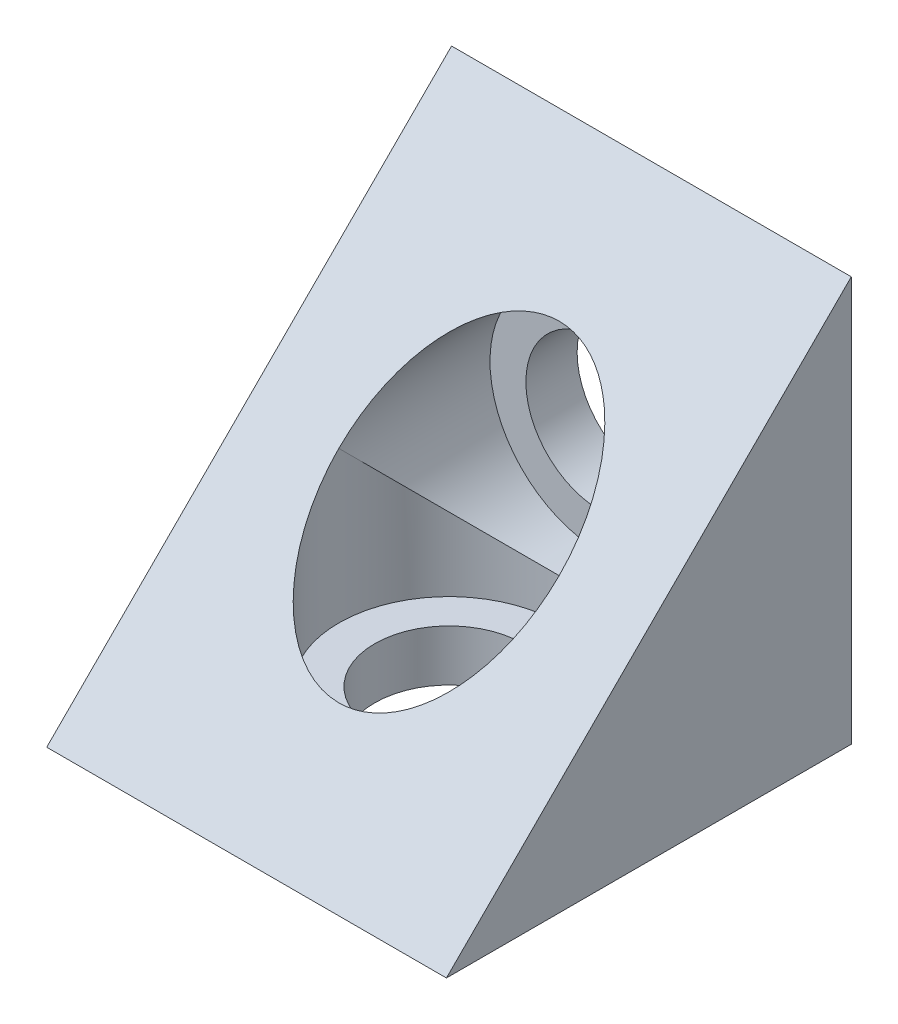
ISO-10303-21;
HEADER;
FILE_DESCRIPTION(('STEP AP214'),'2;1');
FILE_NAME('part.step','',(''),(''),'','','');
FILE_SCHEMA(('AUTOMOTIVE_DESIGN { 1 0 10303 214 1 1 1 1 }'));
ENDSEC;
DATA;
#1=APPLICATION_CONTEXT('core data for automotive mechanical design processes');
#2=APPLICATION_PROTOCOL_DEFINITION('international standard','automotive_design',2000,#1);
#3=PRODUCT_CONTEXT('',#1,'mechanical');
#4=PRODUCT('Part','Part','',(#3));
#5=PRODUCT_RELATED_PRODUCT_CATEGORY('part','',(#4));
#6=PRODUCT_DEFINITION_FORMATION('','',#4);
#7=PRODUCT_DEFINITION_CONTEXT('part definition',#1,'design');
#8=PRODUCT_DEFINITION('design','',#6,#7);
#9=PRODUCT_DEFINITION_SHAPE('','',#8);
#10=(LENGTH_UNIT() NAMED_UNIT(*) SI_UNIT(.MILLI.,.METRE.));
#11=(NAMED_UNIT(*) PLANE_ANGLE_UNIT() SI_UNIT($,.RADIAN.));
#12=(NAMED_UNIT(*) SI_UNIT($,.STERADIAN.) SOLID_ANGLE_UNIT());
#13=UNCERTAINTY_MEASURE_WITH_UNIT(LENGTH_MEASURE(1.E-05),#10,'distance_accuracy_value','');
#14=(GEOMETRIC_REPRESENTATION_CONTEXT(3) GLOBAL_UNCERTAINTY_ASSIGNED_CONTEXT((#13)) GLOBAL_UNIT_ASSIGNED_CONTEXT((#10,
#11,#12)) REPRESENTATION_CONTEXT('',''));
#15=CARTESIAN_POINT('',(0.,0.,0.));
#16=DIRECTION('',(0.,0.,1.));
#17=DIRECTION('',(1.,0.,0.));
#18=AXIS2_PLACEMENT_3D('',#15,#16,#17);
#19=CARTESIAN_POINT('',(9.906,-10.033,-10.033));
#20=DIRECTION('',(0.,1.,0.));
#21=DIRECTION('',(0.,0.,1.));
#22=AXIS2_PLACEMENT_3D('',#19,#20,#21);
#23=PLANE('',#22);
#24=CARTESIAN_POINT('',(0.,-10.033,0.));
#25=DIRECTION('',(0.,1.,0.));
#26=DIRECTION('',(0.,0.,1.));
#27=AXIS2_PLACEMENT_3D('',#24,#25,#26);
#28=CIRCLE('',#27,3.683);
#29=CARTESIAN_POINT('',(0.,-10.033,3.683));
#30=VERTEX_POINT('',#29);
#31=EDGE_CURVE('E101',#30,#30,#28,.T.);
#32=ORIENTED_EDGE('',*,*,#31,.T.);
#33=EDGE_LOOP('',(#32));
#34=FACE_BOUND('',#33,.T.);
#35=DIRECTION('',(0.,0.,-1.));
#36=VECTOR('',#35,1.);
#37=CARTESIAN_POINT('',(-9.906,-10.033,-10.033));
#38=LINE('',#37,#36);
#39=CARTESIAN_POINT('',(-9.906,-10.033,10.033));
#40=VERTEX_POINT('',#39);
#41=CARTESIAN_POINT('',(-9.906,-10.033,-10.033));
#42=VERTEX_POINT('',#41);
#43=EDGE_CURVE('E92',#40,#42,#38,.T.);
#44=ORIENTED_EDGE('',*,*,#43,.T.);
#45=DIRECTION('',(-1.,0.,0.));
#46=VECTOR('',#45,1.);
#47=CARTESIAN_POINT('',(9.906,-10.033,-10.033));
#48=LINE('',#47,#46);
#49=CARTESIAN_POINT('',(9.906,-10.033,-10.033));
#50=VERTEX_POINT('',#49);
#51=EDGE_CURVE('E43',#50,#42,#48,.T.);
#52=ORIENTED_EDGE('',*,*,#51,.F.);
#53=DIRECTION('',(0.,0.,-1.));
#54=VECTOR('',#53,1.);
#55=CARTESIAN_POINT('',(9.906,-10.033,-10.033));
#56=LINE('',#55,#54);
#57=CARTESIAN_POINT('',(9.906,-10.033,10.033));
#58=VERTEX_POINT('',#57);
#59=EDGE_CURVE('E115',#58,#50,#56,.T.);
#60=ORIENTED_EDGE('',*,*,#59,.F.);
#61=DIRECTION('',(-1.,0.,0.));
#62=VECTOR('',#61,1.);
#63=CARTESIAN_POINT('',(9.906,-10.033,10.033));
#64=LINE('',#63,#62);
#65=EDGE_CURVE('E118',#58,#40,#64,.T.);
#66=ORIENTED_EDGE('',*,*,#65,.T.);
#67=EDGE_LOOP('',(#44,#52,#60,#66));
#68=FACE_BOUND('',#67,.T.);
#69=ADVANCED_FACE('F35',(#34,#68),#23,.F.);
#70=CARTESIAN_POINT('',(9.906,10.033,-10.033));
#71=DIRECTION('',(0.,0.,1.));
#72=DIRECTION('',(0.,-1.,0.));
#73=AXIS2_PLACEMENT_3D('',#70,#71,#72);
#74=PLANE('',#73);
#75=CARTESIAN_POINT('',(0.,0.,-10.033));
#76=DIRECTION('',(0.,0.,1.));
#77=DIRECTION('',(1.,0.,0.));
#78=AXIS2_PLACEMENT_3D('',#75,#76,#77);
#79=CIRCLE('',#78,3.683);
#80=CARTESIAN_POINT('',(3.683,0.,-10.033));
#81=VERTEX_POINT('',#80);
#82=EDGE_CURVE('E152',#81,#81,#79,.T.);
#83=ORIENTED_EDGE('',*,*,#82,.T.);
#84=EDGE_LOOP('',(#83));
#85=FACE_BOUND('',#84,.T.);
#86=DIRECTION('',(0.,1.,0.));
#87=VECTOR('',#86,1.);
#88=CARTESIAN_POINT('',(-9.906,10.033,-10.033));
#89=LINE('',#88,#87);
#90=CARTESIAN_POINT('',(-9.906,10.033,-10.033));
#91=VERTEX_POINT('',#90);
#92=EDGE_CURVE('E94',#42,#91,#89,.T.);
#93=ORIENTED_EDGE('',*,*,#92,.T.);
#94=DIRECTION('',(-1.,0.,0.));
#95=VECTOR('',#94,1.);
#96=CARTESIAN_POINT('',(9.906,10.033,-10.033));
#97=LINE('',#96,#95);
#98=CARTESIAN_POINT('',(9.906,10.033,-10.033));
#99=VERTEX_POINT('',#98);
#100=EDGE_CURVE('E122',#99,#91,#97,.T.);
#101=ORIENTED_EDGE('',*,*,#100,.F.);
#102=DIRECTION('',(0.,1.,0.));
#103=VECTOR('',#102,1.);
#104=CARTESIAN_POINT('',(9.906,10.033,-10.033));
#105=LINE('',#104,#103);
#106=EDGE_CURVE('E80',#50,#99,#105,.T.);
#107=ORIENTED_EDGE('',*,*,#106,.F.);
#108=ORIENTED_EDGE('',*,*,#51,.T.);
#109=EDGE_LOOP('',(#93,#101,#107,#108));
#110=FACE_BOUND('',#109,.T.);
#111=ADVANCED_FACE('F124',(#85,#110),#74,.F.);
#112=CARTESIAN_POINT('',(9.906,-10.033,10.033));
#113=DIRECTION('',(0.,-0.707106781186547,-0.707106781186548));
#114=DIRECTION('',(0.,0.707106781186548,-0.707106781186547));
#115=AXIS2_PLACEMENT_3D('',#112,#113,#114);
#116=PLANE('',#115);
#117=CARTESIAN_POINT('',(0.,0.,0.));
#118=DIRECTION('',(0.,-0.707106781186547,-0.707106781186548));
#119=DIRECTION('',(0.,0.707106781186548,-0.707106781186547));
#120=AXIS2_PLACEMENT_3D('',#117,#118,#119);
#121=ELLIPSE('',#120,7.72302026411947,5.461);
#122=CARTESIAN_POINT('',(5.461,0.,0.));
#123=VERTEX_POINT('',#122);
#124=CARTESIAN_POINT('',(-5.461,0.,0.));
#125=VERTEX_POINT('',#124);
#126=EDGE_CURVE('E88',#123,#125,#121,.T.);
#127=ORIENTED_EDGE('',*,*,#126,.T.);
#128=EDGE_CURVE('E49',#125,#123,#121,.T.);
#129=ORIENTED_EDGE('',*,*,#128,.T.);
#130=EDGE_LOOP('',(#127,#129));
#131=FACE_BOUND('',#130,.T.);
#132=DIRECTION('',(0.,-0.707106781186548,0.707106781186547));
#133=VECTOR('',#132,1.);
#134=CARTESIAN_POINT('',(-9.906,-10.033,10.033));
#135=LINE('',#134,#133);
#136=EDGE_CURVE('E74',#91,#40,#135,.T.);
#137=ORIENTED_EDGE('',*,*,#136,.T.);
#138=ORIENTED_EDGE('',*,*,#65,.F.);
#139=DIRECTION('',(0.,-0.707106781186548,0.707106781186547));
#140=VECTOR('',#139,1.);
#141=CARTESIAN_POINT('',(9.906,-10.033,10.033));
#142=LINE('',#141,#140);
#143=EDGE_CURVE('E57',#99,#58,#142,.T.);
#144=ORIENTED_EDGE('',*,*,#143,.F.);
#145=ORIENTED_EDGE('',*,*,#100,.T.);
#146=EDGE_LOOP('',(#137,#138,#144,#145));
#147=FACE_BOUND('',#146,.T.);
#148=ADVANCED_FACE('F87',(#131,#147),#116,.F.);
#149=CARTESIAN_POINT('',(9.906,0.,0.));
#150=DIRECTION('',(1.,0.,0.));
#151=DIRECTION('',(0.,0.,-1.));
#152=AXIS2_PLACEMENT_3D('',#149,#150,#151);
#153=PLANE('',#152);
#154=ORIENTED_EDGE('',*,*,#59,.T.);
#155=ORIENTED_EDGE('',*,*,#106,.T.);
#156=ORIENTED_EDGE('',*,*,#143,.T.);
#157=EDGE_LOOP('',(#154,#155,#156));
#158=FACE_BOUND('',#157,.T.);
#159=ADVANCED_FACE('F131',(#158),#153,.T.);
#160=CARTESIAN_POINT('',(-9.906,0.,0.));
#161=DIRECTION('',(1.,0.,0.));
#162=DIRECTION('',(0.,0.,-1.));
#163=AXIS2_PLACEMENT_3D('',#160,#161,#162);
#164=PLANE('',#163);
#165=ORIENTED_EDGE('',*,*,#43,.F.);
#166=ORIENTED_EDGE('',*,*,#136,.F.);
#167=ORIENTED_EDGE('',*,*,#92,.F.);
#168=EDGE_LOOP('',(#165,#166,#167));
#169=FACE_BOUND('',#168,.T.);
#170=ADVANCED_FACE('F129',(#169),#164,.F.);
#171=CARTESIAN_POINT('',(0.,-25.4790405282389,0.));
#172=DIRECTION('',(0.,1.,0.));
#173=DIRECTION('',(0.,0.,1.));
#174=AXIS2_PLACEMENT_3D('',#171,#172,#173);
#175=CYLINDRICAL_SURFACE('',#174,5.461);
#176=CARTESIAN_POINT('',(0.,-7.49299999999999,0.));
#177=DIRECTION('',(0.,1.,0.));
#178=DIRECTION('',(0.,0.,1.));
#179=AXIS2_PLACEMENT_3D('',#176,#177,#178);
#180=CIRCLE('',#179,5.461);
#181=CARTESIAN_POINT('',(0.,-7.49299999999999,5.461));
#182=VERTEX_POINT('',#181);
#183=EDGE_CURVE('E89',#182,#182,#180,.F.);
#184=ORIENTED_EDGE('',*,*,#183,.T.);
#185=EDGE_LOOP('',(#184));
#186=FACE_BOUND('',#185,.T.);
#187=ORIENTED_EDGE('',*,*,#126,.F.);
#188=CARTESIAN_POINT('',(0.,0.,0.));
#189=DIRECTION('',(0.,0.707106781186547,-0.707106781186547));
#190=DIRECTION('',(0.,0.707106781186547,0.707106781186547));
#191=AXIS2_PLACEMENT_3D('',#188,#189,#190);
#192=ELLIPSE('',#191,7.72302026411947,5.461);
#193=EDGE_CURVE('E12',#123,#125,#192,.T.);
#194=ORIENTED_EDGE('',*,*,#193,.T.);
#195=EDGE_LOOP('',(#187,#194));
#196=FACE_BOUND('',#195,.T.);
#197=ADVANCED_FACE('F91',(#186,#196),#175,.F.);
#198=CARTESIAN_POINT('',(9.906,-7.49299999999999,-10.033));
#199=DIRECTION('',(0.,1.,0.));
#200=DIRECTION('',(0.,0.,1.));
#201=AXIS2_PLACEMENT_3D('',#198,#199,#200);
#202=PLANE('',#201);
#203=CARTESIAN_POINT('',(0.,-7.49299999999999,0.));
#204=DIRECTION('',(0.,1.,0.));
#205=DIRECTION('',(0.,0.,1.));
#206=AXIS2_PLACEMENT_3D('',#203,#204,#205);
#207=CIRCLE('',#206,3.683);
#208=CARTESIAN_POINT('',(0.,-7.49299999999999,3.683));
#209=VERTEX_POINT('',#208);
#210=EDGE_CURVE('E99',#209,#209,#207,.T.);
#211=ORIENTED_EDGE('',*,*,#210,.F.);
#212=EDGE_LOOP('',(#211));
#213=FACE_BOUND('',#212,.T.);
#214=ORIENTED_EDGE('',*,*,#183,.F.);
#215=EDGE_LOOP('',(#214));
#216=FACE_BOUND('',#215,.T.);
#217=ADVANCED_FACE('F137',(#213,#216),#202,.T.);
#218=CARTESIAN_POINT('',(0.,-10.033,0.));
#219=DIRECTION('',(0.,1.,0.));
#220=DIRECTION('',(0.,0.,1.));
#221=AXIS2_PLACEMENT_3D('',#218,#219,#220);
#222=CYLINDRICAL_SURFACE('',#221,3.683);
#223=ORIENTED_EDGE('',*,*,#210,.T.);
#224=EDGE_LOOP('',(#223));
#225=FACE_BOUND('',#224,.T.);
#226=ORIENTED_EDGE('',*,*,#31,.F.);
#227=EDGE_LOOP('',(#226));
#228=FACE_BOUND('',#227,.T.);
#229=ADVANCED_FACE('F166',(#225,#228),#222,.F.);
#230=CARTESIAN_POINT('',(0.,0.,-25.4790405282389));
#231=DIRECTION('',(0.,0.,1.));
#232=DIRECTION('',(1.,0.,0.));
#233=AXIS2_PLACEMENT_3D('',#230,#231,#232);
#234=CYLINDRICAL_SURFACE('',#233,5.461);
#235=CARTESIAN_POINT('',(0.,0.,-7.493));
#236=DIRECTION('',(0.,0.,1.));
#237=DIRECTION('',(0.,-1.,0.));
#238=AXIS2_PLACEMENT_3D('',#235,#236,#237);
#239=CIRCLE('',#238,5.461);
#240=CARTESIAN_POINT('',(0.,-5.461,-7.493));
#241=VERTEX_POINT('',#240);
#242=EDGE_CURVE('E107',#241,#241,#239,.F.);
#243=ORIENTED_EDGE('',*,*,#242,.T.);
#244=EDGE_LOOP('',(#243));
#245=FACE_BOUND('',#244,.T.);
#246=ORIENTED_EDGE('',*,*,#193,.F.);
#247=ORIENTED_EDGE('',*,*,#128,.F.);
#248=EDGE_LOOP('',(#246,#247));
#249=FACE_BOUND('',#248,.T.);
#250=ADVANCED_FACE('F82',(#245,#249),#234,.F.);
#251=CARTESIAN_POINT('',(9.906,10.033,-7.493));
#252=DIRECTION('',(0.,0.,1.));
#253=DIRECTION('',(0.,-1.,0.));
#254=AXIS2_PLACEMENT_3D('',#251,#252,#253);
#255=PLANE('',#254);
#256=CARTESIAN_POINT('',(0.,0.,-7.493));
#257=DIRECTION('',(0.,0.,1.));
#258=DIRECTION('',(0.,-1.,0.));
#259=AXIS2_PLACEMENT_3D('',#256,#257,#258);
#260=CIRCLE('',#259,3.683);
#261=CARTESIAN_POINT('',(0.,-3.683,-7.493));
#262=VERTEX_POINT('',#261);
#263=EDGE_CURVE('E38',#262,#262,#260,.T.);
#264=ORIENTED_EDGE('',*,*,#263,.F.);
#265=EDGE_LOOP('',(#264));
#266=FACE_BOUND('',#265,.T.);
#267=ORIENTED_EDGE('',*,*,#242,.F.);
#268=EDGE_LOOP('',(#267));
#269=FACE_BOUND('',#268,.T.);
#270=ADVANCED_FACE('F159',(#266,#269),#255,.T.);
#271=CARTESIAN_POINT('',(0.,0.,-10.033));
#272=DIRECTION('',(0.,0.,1.));
#273=DIRECTION('',(1.,0.,0.));
#274=AXIS2_PLACEMENT_3D('',#271,#272,#273);
#275=CYLINDRICAL_SURFACE('',#274,3.683);
#276=ORIENTED_EDGE('',*,*,#263,.T.);
#277=EDGE_LOOP('',(#276));
#278=FACE_BOUND('',#277,.T.);
#279=ORIENTED_EDGE('',*,*,#82,.F.);
#280=EDGE_LOOP('',(#279));
#281=FACE_BOUND('',#280,.T.);
#282=ADVANCED_FACE('F157',(#278,#281),#275,.F.);
#283=CLOSED_SHELL('',(#69,#111,#148,#159,#170,#197,#217,#229,#250,#270,#282));
#284=MANIFOLD_SOLID_BREP('B2',#283);
#285=ADVANCED_BREP_SHAPE_REPRESENTATION('',(#18,#284),#14);
#286=SHAPE_DEFINITION_REPRESENTATION(#9,#285);
ENDSEC;
END-ISO-10303-21;
